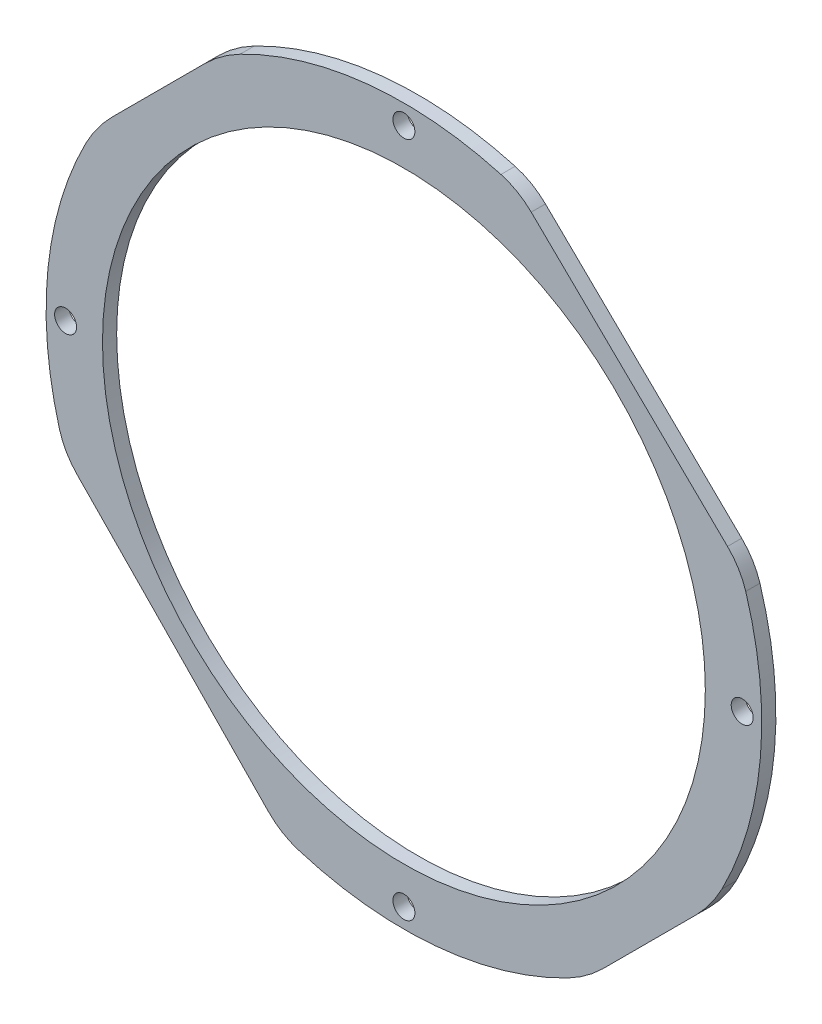
ISO-10303-21;
HEADER;
FILE_DESCRIPTION(('STEP AP214'),'2;1');
FILE_NAME('part.step','',(''),(''),'','','');
FILE_SCHEMA(('AUTOMOTIVE_DESIGN { 1 0 10303 214 1 1 1 1 }'));
ENDSEC;
DATA;
#1=APPLICATION_CONTEXT('core data for automotive mechanical design processes');
#2=APPLICATION_PROTOCOL_DEFINITION('international standard','automotive_design',2000,#1);
#3=PRODUCT_CONTEXT('',#1,'mechanical');
#4=PRODUCT('Part','Part','',(#3));
#5=PRODUCT_RELATED_PRODUCT_CATEGORY('part','',(#4));
#6=PRODUCT_DEFINITION_FORMATION('','',#4);
#7=PRODUCT_DEFINITION_CONTEXT('part definition',#1,'design');
#8=PRODUCT_DEFINITION('design','',#6,#7);
#9=PRODUCT_DEFINITION_SHAPE('','',#8);
#10=(LENGTH_UNIT() NAMED_UNIT(*) SI_UNIT(.MILLI.,.METRE.));
#11=(NAMED_UNIT(*) PLANE_ANGLE_UNIT() SI_UNIT($,.RADIAN.));
#12=(NAMED_UNIT(*) SI_UNIT($,.STERADIAN.) SOLID_ANGLE_UNIT());
#13=UNCERTAINTY_MEASURE_WITH_UNIT(LENGTH_MEASURE(1.E-05),#10,'distance_accuracy_value','');
#14=(GEOMETRIC_REPRESENTATION_CONTEXT(3) GLOBAL_UNCERTAINTY_ASSIGNED_CONTEXT((#13)) GLOBAL_UNIT_ASSIGNED_CONTEXT((#10,
#11,#12)) REPRESENTATION_CONTEXT('',''));
#15=CARTESIAN_POINT('',(0.,0.,0.));
#16=DIRECTION('',(0.,0.,1.));
#17=DIRECTION('',(1.,0.,0.));
#18=AXIS2_PLACEMENT_3D('',#15,#16,#17);
#19=CARTESIAN_POINT('',(0.,0.,2.));
#20=DIRECTION('',(0.,0.,1.));
#21=DIRECTION('',(1.,0.,0.));
#22=AXIS2_PLACEMENT_3D('',#19,#20,#21);
#23=PLANE('',#22);
#24=CARTESIAN_POINT('',(0.,0.,2.));
#25=DIRECTION('',(0.,0.,1.));
#26=DIRECTION('',(1.,0.,0.));
#27=AXIS2_PLACEMENT_3D('',#24,#25,#26);
#28=CIRCLE('',#27,50.45);
#29=CARTESIAN_POINT('',(44.8520396346069,-23.0975548622718,2.));
#30=VERTEX_POINT('',#29);
#31=CARTESIAN_POINT('',(48.1983056678512,14.903886431008,2.));
#32=VERTEX_POINT('',#31);
#33=EDGE_CURVE('E197',#30,#32,#28,.T.);
#34=ORIENTED_EDGE('',*,*,#33,.T.);
#35=CARTESIAN_POINT('',(38.6446276365626,11.9496968510262,2.));
#36=DIRECTION('',(0.,0.,1.));
#37=DIRECTION('',(1.,0.,0.));
#38=AXIS2_PLACEMENT_3D('',#35,#36,#37);
#39=CIRCLE('',#38,10.);
#40=CARTESIAN_POINT('',(45.6260217426126,19.1093153000785,2.));
#41=VERTEX_POINT('',#40);
#42=EDGE_CURVE('E264',#32,#41,#39,.T.);
#43=ORIENTED_EDGE('',*,*,#42,.T.);
#44=DIRECTION('',(0.715961844905232,-0.698139410605001,0.));
#45=VECTOR('',#44,1.);
#46=CARTESIAN_POINT('',(14.4791981741218,49.4808011593596,2.));
#47=LINE('',#46,#45);
#48=CARTESIAN_POINT('',(17.9533452758254,46.0931359825101,2.));
#49=VERTEX_POINT('',#48);
#50=EDGE_CURVE('E250',#49,#41,#47,.T.);
#51=ORIENTED_EDGE('',*,*,#50,.F.);
#52=CARTESIAN_POINT('',(10.9719511697754,38.9335175334578,2.));
#53=DIRECTION('',(0.,0.,1.));
#54=DIRECTION('',(1.,0.,0.));
#55=AXIS2_PLACEMENT_3D('',#52,#53,#54);
#56=CIRCLE('',#55,10.);
#57=CARTESIAN_POINT('',(13.6844236468522,48.5586145751037,2.));
#58=VERTEX_POINT('',#57);
#59=EDGE_CURVE('E262',#49,#58,#56,.T.);
#60=ORIENTED_EDGE('',*,*,#59,.T.);
#61=CARTESIAN_POINT('',(-23.0975548622721,44.8520396346067,2.));
#62=VERTEX_POINT('',#61);
#63=EDGE_CURVE('E194',#58,#62,#28,.T.);
#64=ORIENTED_EDGE('',*,*,#63,.T.);
#65=CARTESIAN_POINT('',(-13.9409424292604,27.0712508795595,2.));
#66=DIRECTION('',(0.,0.,1.));
#67=DIRECTION('',(1.,0.,0.));
#68=AXIS2_PLACEMENT_3D('',#65,#66,#67);
#69=CIRCLE('',#68,20.);
#70=CARTESIAN_POINT('',(-28.0830780529913,41.2133865032904,2.));
#71=VERTEX_POINT('',#70);
#72=EDGE_CURVE('E191',#62,#71,#69,.T.);
#73=ORIENTED_EDGE('',*,*,#72,.T.);
#74=DIRECTION('',(0.707106781186546,0.707106781186549,0.));
#75=VECTOR('',#74,1.);
#76=CARTESIAN_POINT('',(-26.1569867864594,43.1394777698223,2.));
#77=LINE('',#76,#75);
#78=CARTESIAN_POINT('',(-41.2133865032905,28.0830780529911,2.));
#79=VERTEX_POINT('',#78);
#80=EDGE_CURVE('E239',#79,#71,#77,.T.);
#81=ORIENTED_EDGE('',*,*,#80,.F.);
#82=CARTESIAN_POINT('',(-27.0712508795595,13.9409424292602,2.));
#83=DIRECTION('',(0.,0.,1.));
#84=DIRECTION('',(1.,0.,0.));
#85=AXIS2_PLACEMENT_3D('',#82,#83,#84);
#86=CIRCLE('',#85,20.);
#87=CARTESIAN_POINT('',(-44.8520396346068,23.0975548622718,2.));
#88=VERTEX_POINT('',#87);
#89=EDGE_CURVE('E193',#79,#88,#86,.T.);
#90=ORIENTED_EDGE('',*,*,#89,.T.);
#91=CARTESIAN_POINT('',(-48.5586145751037,-13.6844236468521,2.));
#92=VERTEX_POINT('',#91);
#93=EDGE_CURVE('E202',#88,#92,#28,.T.);
#94=ORIENTED_EDGE('',*,*,#93,.T.);
#95=CARTESIAN_POINT('',(-38.9335175334578,-10.9719511697754,2.));
#96=DIRECTION('',(0.,0.,1.));
#97=DIRECTION('',(1.,0.,0.));
#98=AXIS2_PLACEMENT_3D('',#95,#96,#97);
#99=CIRCLE('',#98,10.);
#100=CARTESIAN_POINT('',(-46.0931359825101,-17.9533452758254,2.));
#101=VERTEX_POINT('',#100);
#102=EDGE_CURVE('E258',#92,#101,#99,.T.);
#103=ORIENTED_EDGE('',*,*,#102,.T.);
#104=DIRECTION('',(-0.698139410605004,0.715961844905228,0.));
#105=VECTOR('',#104,1.);
#106=CARTESIAN_POINT('',(-49.4808011593596,-14.4791981741218,2.));
#107=LINE('',#106,#105);
#108=CARTESIAN_POINT('',(-19.109315300078,-45.6260217426127,2.));
#109=VERTEX_POINT('',#108);
#110=EDGE_CURVE('E165',#109,#101,#107,.T.);
#111=ORIENTED_EDGE('',*,*,#110,.F.);
#112=CARTESIAN_POINT('',(-11.9496968510257,-38.6446276365627,2.));
#113=DIRECTION('',(0.,0.,1.));
#114=DIRECTION('',(1.,0.,0.));
#115=AXIS2_PLACEMENT_3D('',#112,#113,#114);
#116=CIRCLE('',#115,10.);
#117=CARTESIAN_POINT('',(-14.9038864310074,-48.1983056678514,2.));
#118=VERTEX_POINT('',#117);
#119=EDGE_CURVE('E260',#109,#118,#116,.T.);
#120=ORIENTED_EDGE('',*,*,#119,.T.);
#121=CARTESIAN_POINT('',(23.097554862272,-44.8520396346067,2.));
#122=VERTEX_POINT('',#121);
#123=EDGE_CURVE('E200',#118,#122,#28,.T.);
#124=ORIENTED_EDGE('',*,*,#123,.T.);
#125=CARTESIAN_POINT('',(13.9409424292603,-27.0712508795595,2.));
#126=DIRECTION('',(0.,0.,1.));
#127=DIRECTION('',(1.,0.,0.));
#128=AXIS2_PLACEMENT_3D('',#125,#126,#127);
#129=CIRCLE('',#128,20.);
#130=CARTESIAN_POINT('',(28.0830780529913,-41.2133865032904,2.));
#131=VERTEX_POINT('',#130);
#132=EDGE_CURVE('E198',#122,#131,#129,.T.);
#133=ORIENTED_EDGE('',*,*,#132,.T.);
#134=DIRECTION('',(-0.707106781186546,-0.707106781186549,0.));
#135=VECTOR('',#134,1.);
#136=CARTESIAN_POINT('',(26.1569867864594,-43.1394777698223,2.));
#137=LINE('',#136,#135);
#138=CARTESIAN_POINT('',(41.2133865032905,-28.0830780529911,2.));
#139=VERTEX_POINT('',#138);
#140=EDGE_CURVE('E161',#139,#131,#137,.T.);
#141=ORIENTED_EDGE('',*,*,#140,.F.);
#142=CARTESIAN_POINT('',(27.0712508795595,-13.9409424292602,2.));
#143=DIRECTION('',(0.,0.,1.));
#144=DIRECTION('',(1.,0.,0.));
#145=AXIS2_PLACEMENT_3D('',#142,#143,#144);
#146=CIRCLE('',#145,20.);
#147=EDGE_CURVE('E195',#139,#30,#146,.T.);
#148=ORIENTED_EDGE('',*,*,#147,.T.);
#149=EDGE_LOOP('',(#34,#43,#51,#60,#64,#73,#81,#90,#94,#103,#111,#120,#124,#133,#141,#148));
#150=FACE_BOUND('',#149,.T.);
#151=CARTESIAN_POINT('',(0.,-47.7,2.));
#152=DIRECTION('',(0.,0.,1.));
#153=DIRECTION('',(1.,0.,0.));
#154=AXIS2_PLACEMENT_3D('',#151,#152,#153);
#155=CIRCLE('',#154,1.55000000000257);
#156=CARTESIAN_POINT('',(1.55000000000259,-47.7,2.));
#157=VERTEX_POINT('',#156);
#158=EDGE_CURVE('E229',#157,#157,#155,.T.);
#159=ORIENTED_EDGE('',*,*,#158,.F.);
#160=EDGE_LOOP('',(#159));
#161=FACE_BOUND('',#160,.T.);
#162=CARTESIAN_POINT('',(0.,0.,2.));
#163=DIRECTION('',(0.,0.,1.));
#164=DIRECTION('',(1.,0.,0.));
#165=AXIS2_PLACEMENT_3D('',#162,#163,#164);
#166=CIRCLE('',#165,42.5);
#167=CARTESIAN_POINT('',(42.5,0.,2.));
#168=VERTEX_POINT('',#167);
#169=EDGE_CURVE('E217',#168,#168,#166,.T.);
#170=ORIENTED_EDGE('',*,*,#169,.F.);
#171=EDGE_LOOP('',(#170));
#172=FACE_BOUND('',#171,.T.);
#173=CARTESIAN_POINT('',(0.,47.7,2.));
#174=DIRECTION('',(0.,0.,1.));
#175=DIRECTION('',(1.,0.,0.));
#176=AXIS2_PLACEMENT_3D('',#173,#174,#175);
#177=CIRCLE('',#176,1.55);
#178=CARTESIAN_POINT('',(1.55,47.7,2.));
#179=VERTEX_POINT('',#178);
#180=EDGE_CURVE('E205',#179,#179,#177,.T.);
#181=ORIENTED_EDGE('',*,*,#180,.F.);
#182=EDGE_LOOP('',(#181));
#183=FACE_BOUND('',#182,.T.);
#184=CARTESIAN_POINT('',(47.7,0.,2.));
#185=DIRECTION('',(0.,0.,1.));
#186=DIRECTION('',(1.,0.,0.));
#187=AXIS2_PLACEMENT_3D('',#184,#185,#186);
#188=CIRCLE('',#187,1.55000000000168);
#189=CARTESIAN_POINT('',(49.2500000000017,0.,2.));
#190=VERTEX_POINT('',#189);
#191=EDGE_CURVE('E223',#190,#190,#188,.T.);
#192=ORIENTED_EDGE('',*,*,#191,.F.);
#193=EDGE_LOOP('',(#192));
#194=FACE_BOUND('',#193,.T.);
#195=CARTESIAN_POINT('',(-47.7,0.,2.));
#196=DIRECTION('',(0.,0.,1.));
#197=DIRECTION('',(1.,0.,0.));
#198=AXIS2_PLACEMENT_3D('',#195,#196,#197);
#199=CIRCLE('',#198,1.55000000000089);
#200=CARTESIAN_POINT('',(-46.1499999999991,0.,2.));
#201=VERTEX_POINT('',#200);
#202=EDGE_CURVE('E235',#201,#201,#199,.T.);
#203=ORIENTED_EDGE('',*,*,#202,.F.);
#204=EDGE_LOOP('',(#203));
#205=FACE_BOUND('',#204,.T.);
#206=ADVANCED_FACE('F38',(#150,#161,#172,#183,#194,#205),#23,.T.);
#207=CARTESIAN_POINT('',(0.,0.,0.));
#208=DIRECTION('',(0.,0.,1.));
#209=DIRECTION('',(1.,0.,0.));
#210=AXIS2_PLACEMENT_3D('',#207,#208,#209);
#211=PLANE('',#210);
#212=CARTESIAN_POINT('',(-47.7,0.,0.));
#213=DIRECTION('',(0.,0.,1.));
#214=DIRECTION('',(1.,0.,0.));
#215=AXIS2_PLACEMENT_3D('',#212,#213,#214);
#216=CIRCLE('',#215,1.55000000000089);
#217=CARTESIAN_POINT('',(-46.1499999999991,0.,0.));
#218=VERTEX_POINT('',#217);
#219=EDGE_CURVE('E232',#218,#218,#216,.T.);
#220=ORIENTED_EDGE('',*,*,#219,.T.);
#221=EDGE_LOOP('',(#220));
#222=FACE_BOUND('',#221,.T.);
#223=CARTESIAN_POINT('',(0.,-47.7,0.));
#224=DIRECTION('',(0.,0.,1.));
#225=DIRECTION('',(1.,0.,0.));
#226=AXIS2_PLACEMENT_3D('',#223,#224,#225);
#227=CIRCLE('',#226,1.55000000000257);
#228=CARTESIAN_POINT('',(1.55000000000259,-47.7,0.));
#229=VERTEX_POINT('',#228);
#230=EDGE_CURVE('E226',#229,#229,#227,.T.);
#231=ORIENTED_EDGE('',*,*,#230,.T.);
#232=EDGE_LOOP('',(#231));
#233=FACE_BOUND('',#232,.T.);
#234=CARTESIAN_POINT('',(47.7,0.,0.));
#235=DIRECTION('',(0.,0.,1.));
#236=DIRECTION('',(1.,0.,0.));
#237=AXIS2_PLACEMENT_3D('',#234,#235,#236);
#238=CIRCLE('',#237,1.55000000000168);
#239=CARTESIAN_POINT('',(49.2500000000017,0.,0.));
#240=VERTEX_POINT('',#239);
#241=EDGE_CURVE('E220',#240,#240,#238,.T.);
#242=ORIENTED_EDGE('',*,*,#241,.T.);
#243=EDGE_LOOP('',(#242));
#244=FACE_BOUND('',#243,.T.);
#245=CARTESIAN_POINT('',(0.,0.,0.));
#246=DIRECTION('',(0.,0.,1.));
#247=DIRECTION('',(1.,0.,0.));
#248=AXIS2_PLACEMENT_3D('',#245,#246,#247);
#249=CIRCLE('',#248,42.5);
#250=CARTESIAN_POINT('',(42.5,0.,0.));
#251=VERTEX_POINT('',#250);
#252=EDGE_CURVE('E214',#251,#251,#249,.T.);
#253=ORIENTED_EDGE('',*,*,#252,.T.);
#254=EDGE_LOOP('',(#253));
#255=FACE_BOUND('',#254,.T.);
#256=CARTESIAN_POINT('',(0.,47.7,0.));
#257=DIRECTION('',(0.,0.,1.));
#258=DIRECTION('',(1.,0.,0.));
#259=AXIS2_PLACEMENT_3D('',#256,#257,#258);
#260=CIRCLE('',#259,1.55);
#261=CARTESIAN_POINT('',(1.55,47.7,0.));
#262=VERTEX_POINT('',#261);
#263=EDGE_CURVE('E211',#262,#262,#260,.T.);
#264=ORIENTED_EDGE('',*,*,#263,.T.);
#265=EDGE_LOOP('',(#264));
#266=FACE_BOUND('',#265,.T.);
#267=DIRECTION('',(0.715961844905232,-0.698139410605,0.));
#268=VECTOR('',#267,1.);
#269=CARTESIAN_POINT('',(31.789683509219,32.6012256412943,0.));
#270=LINE('',#269,#268);
#271=CARTESIAN_POINT('',(17.9533452758254,46.0931359825101,0.));
#272=VERTEX_POINT('',#271);
#273=CARTESIAN_POINT('',(45.6260217426126,19.1093153000785,0.));
#274=VERTEX_POINT('',#273);
#275=EDGE_CURVE('E311',#272,#274,#270,.T.);
#276=ORIENTED_EDGE('',*,*,#275,.T.);
#277=CARTESIAN_POINT('',(38.6446276365626,11.9496968510262,0.));
#278=DIRECTION('',(0.,0.,1.));
#279=DIRECTION('',(1.,0.,0.));
#280=AXIS2_PLACEMENT_3D('',#277,#278,#279);
#281=CIRCLE('',#280,10.);
#282=CARTESIAN_POINT('',(48.1983056678512,14.903886431008,0.));
#283=VERTEX_POINT('',#282);
#284=EDGE_CURVE('E274',#274,#283,#281,.F.);
#285=ORIENTED_EDGE('',*,*,#284,.T.);
#286=CARTESIAN_POINT('',(0.,0.,0.));
#287=DIRECTION('',(0.,0.,1.));
#288=DIRECTION('',(1.,0.,0.));
#289=AXIS2_PLACEMENT_3D('',#286,#287,#288);
#290=CIRCLE('',#289,50.45);
#291=CARTESIAN_POINT('',(44.8520396346069,-23.0975548622718,0.));
#292=VERTEX_POINT('',#291);
#293=EDGE_CURVE('E206',#292,#283,#290,.T.);
#294=ORIENTED_EDGE('',*,*,#293,.F.);
#295=CARTESIAN_POINT('',(27.0712508795595,-13.9409424292602,0.));
#296=DIRECTION('',(0.,0.,1.));
#297=DIRECTION('',(1.,0.,0.));
#298=AXIS2_PLACEMENT_3D('',#295,#296,#297);
#299=CIRCLE('',#298,20.);
#300=CARTESIAN_POINT('',(41.2133865032905,-28.0830780529911,0.));
#301=VERTEX_POINT('',#300);
#302=EDGE_CURVE('E174',#292,#301,#299,.F.);
#303=ORIENTED_EDGE('',*,*,#302,.T.);
#304=DIRECTION('',(-0.707106781186546,-0.707106781186549,0.));
#305=VECTOR('',#304,1.);
#306=CARTESIAN_POINT('',(34.6482322781409,-34.6482322781407,0.));
#307=LINE('',#306,#305);
#308=CARTESIAN_POINT('',(28.0830780529913,-41.2133865032904,0.));
#309=VERTEX_POINT('',#308);
#310=EDGE_CURVE('E158',#301,#309,#307,.T.);
#311=ORIENTED_EDGE('',*,*,#310,.T.);
#312=CARTESIAN_POINT('',(13.9409424292603,-27.0712508795595,0.));
#313=DIRECTION('',(0.,0.,1.));
#314=DIRECTION('',(1.,0.,0.));
#315=AXIS2_PLACEMENT_3D('',#312,#313,#314);
#316=CIRCLE('',#315,20.);
#317=CARTESIAN_POINT('',(23.097554862272,-44.8520396346067,0.));
#318=VERTEX_POINT('',#317);
#319=EDGE_CURVE('E171',#309,#318,#316,.F.);
#320=ORIENTED_EDGE('',*,*,#319,.T.);
#321=CARTESIAN_POINT('',(-14.9038864310074,-48.1983056678514,0.));
#322=VERTEX_POINT('',#321);
#323=EDGE_CURVE('E179',#322,#318,#290,.T.);
#324=ORIENTED_EDGE('',*,*,#323,.F.);
#325=CARTESIAN_POINT('',(-11.9496968510257,-38.6446276365627,0.));
#326=DIRECTION('',(0.,0.,1.));
#327=DIRECTION('',(1.,0.,0.));
#328=AXIS2_PLACEMENT_3D('',#325,#326,#327);
#329=CIRCLE('',#328,10.);
#330=CARTESIAN_POINT('',(-19.109315300078,-45.6260217426127,0.));
#331=VERTEX_POINT('',#330);
#332=EDGE_CURVE('E271',#322,#331,#329,.F.);
#333=ORIENTED_EDGE('',*,*,#332,.T.);
#334=DIRECTION('',(-0.698139410605004,0.715961844905228,0.));
#335=VECTOR('',#334,1.);
#336=CARTESIAN_POINT('',(-32.601225641294,-31.7896835092191,0.));
#337=LINE('',#336,#335);
#338=CARTESIAN_POINT('',(-46.0931359825101,-17.9533452758254,0.));
#339=VERTEX_POINT('',#338);
#340=EDGE_CURVE('E190',#331,#339,#337,.T.);
#341=ORIENTED_EDGE('',*,*,#340,.T.);
#342=CARTESIAN_POINT('',(-38.9335175334578,-10.9719511697754,0.));
#343=DIRECTION('',(0.,0.,1.));
#344=DIRECTION('',(1.,0.,0.));
#345=AXIS2_PLACEMENT_3D('',#342,#343,#344);
#346=CIRCLE('',#345,10.);
#347=CARTESIAN_POINT('',(-48.5586145751037,-13.6844236468521,0.));
#348=VERTEX_POINT('',#347);
#349=EDGE_CURVE('E61',#339,#348,#346,.F.);
#350=ORIENTED_EDGE('',*,*,#349,.T.);
#351=CARTESIAN_POINT('',(-44.8520396346068,23.0975548622718,0.));
#352=VERTEX_POINT('',#351);
#353=EDGE_CURVE('E182',#352,#348,#290,.T.);
#354=ORIENTED_EDGE('',*,*,#353,.F.);
#355=CARTESIAN_POINT('',(-27.0712508795595,13.9409424292602,0.));
#356=DIRECTION('',(0.,0.,1.));
#357=DIRECTION('',(1.,0.,0.));
#358=AXIS2_PLACEMENT_3D('',#355,#356,#357);
#359=CIRCLE('',#358,20.);
#360=CARTESIAN_POINT('',(-41.2133865032905,28.0830780529911,0.));
#361=VERTEX_POINT('',#360);
#362=EDGE_CURVE('E187',#352,#361,#359,.F.);
#363=ORIENTED_EDGE('',*,*,#362,.T.);
#364=DIRECTION('',(0.707106781186546,0.707106781186549,0.));
#365=VECTOR('',#364,1.);
#366=CARTESIAN_POINT('',(-34.6482322781409,34.6482322781407,0.));
#367=LINE('',#366,#365);
#368=CARTESIAN_POINT('',(-28.0830780529913,41.2133865032904,0.));
#369=VERTEX_POINT('',#368);
#370=EDGE_CURVE('E189',#361,#369,#367,.T.);
#371=ORIENTED_EDGE('',*,*,#370,.T.);
#372=CARTESIAN_POINT('',(-13.9409424292604,27.0712508795595,0.));
#373=DIRECTION('',(0.,0.,1.));
#374=DIRECTION('',(1.,0.,0.));
#375=AXIS2_PLACEMENT_3D('',#372,#373,#374);
#376=CIRCLE('',#375,20.);
#377=CARTESIAN_POINT('',(-23.0975548622721,44.8520396346067,0.));
#378=VERTEX_POINT('',#377);
#379=EDGE_CURVE('E243',#369,#378,#376,.F.);
#380=ORIENTED_EDGE('',*,*,#379,.T.);
#381=CARTESIAN_POINT('',(13.6844236468522,48.5586145751037,0.));
#382=VERTEX_POINT('',#381);
#383=EDGE_CURVE('E183',#382,#378,#290,.T.);
#384=ORIENTED_EDGE('',*,*,#383,.F.);
#385=CARTESIAN_POINT('',(10.9719511697754,38.9335175334578,0.));
#386=DIRECTION('',(0.,0.,1.));
#387=DIRECTION('',(1.,0.,0.));
#388=AXIS2_PLACEMENT_3D('',#385,#386,#387);
#389=CIRCLE('',#388,10.);
#390=EDGE_CURVE('E53',#382,#272,#389,.F.);
#391=ORIENTED_EDGE('',*,*,#390,.T.);
#392=EDGE_LOOP('',(#276,#285,#294,#303,#311,#320,#324,#333,#341,#350,#354,#363,#371,#380,#384,#391));
#393=FACE_BOUND('',#392,.T.);
#394=ADVANCED_FACE('F169',(#222,#233,#244,#255,#266,#393),#211,.F.);
#395=CARTESIAN_POINT('',(0.,0.,2.));
#396=DIRECTION('',(0.,0.,-1.));
#397=DIRECTION('',(-1.,0.,0.));
#398=AXIS2_PLACEMENT_3D('',#395,#396,#397);
#399=CYLINDRICAL_SURFACE('',#398,50.45);
#400=ORIENTED_EDGE('',*,*,#123,.F.);
#401=DIRECTION('',(0.,0.,-1.));
#402=VECTOR('',#401,1.);
#403=CARTESIAN_POINT('',(-14.9038864310074,-48.1983056678514,2.));
#404=LINE('',#403,#402);
#405=EDGE_CURVE('E278',#118,#322,#404,.T.);
#406=ORIENTED_EDGE('',*,*,#405,.T.);
#407=ORIENTED_EDGE('',*,*,#323,.T.);
#408=DIRECTION('',(0.,0.,-1.));
#409=VECTOR('',#408,1.);
#410=CARTESIAN_POINT('',(23.097554862272,-44.8520396346067,2.));
#411=LINE('',#410,#409);
#412=EDGE_CURVE('E178',#318,#122,#411,.F.);
#413=ORIENTED_EDGE('',*,*,#412,.T.);
#414=EDGE_LOOP('',(#400,#406,#407,#413));
#415=FACE_BOUND('',#414,.T.);
#416=ADVANCED_FACE('F298',(#415),#399,.T.);
#417=ORIENTED_EDGE('',*,*,#293,.T.);
#418=DIRECTION('',(0.,0.,-1.));
#419=VECTOR('',#418,1.);
#420=CARTESIAN_POINT('',(48.1983056678512,14.903886431008,2.));
#421=LINE('',#420,#419);
#422=EDGE_CURVE('E253',#283,#32,#421,.F.);
#423=ORIENTED_EDGE('',*,*,#422,.T.);
#424=ORIENTED_EDGE('',*,*,#33,.F.);
#425=DIRECTION('',(0.,0.,-1.));
#426=VECTOR('',#425,1.);
#427=CARTESIAN_POINT('',(44.8520396346069,-23.0975548622718,2.));
#428=LINE('',#427,#426);
#429=EDGE_CURVE('E209',#30,#292,#428,.T.);
#430=ORIENTED_EDGE('',*,*,#429,.T.);
#431=EDGE_LOOP('',(#417,#423,#424,#430));
#432=FACE_BOUND('',#431,.T.);
#433=ADVANCED_FACE('F332',(#432),#399,.T.);
#434=ORIENTED_EDGE('',*,*,#63,.F.);
#435=DIRECTION('',(0.,0.,-1.));
#436=VECTOR('',#435,1.);
#437=CARTESIAN_POINT('',(13.6844236468522,48.5586145751037,2.));
#438=LINE('',#437,#436);
#439=EDGE_CURVE('E276',#58,#382,#438,.T.);
#440=ORIENTED_EDGE('',*,*,#439,.T.);
#441=ORIENTED_EDGE('',*,*,#383,.T.);
#442=DIRECTION('',(0.,0.,-1.));
#443=VECTOR('',#442,1.);
#444=CARTESIAN_POINT('',(-23.0975548622721,44.8520396346067,2.));
#445=LINE('',#444,#443);
#446=EDGE_CURVE('E318',#378,#62,#445,.F.);
#447=ORIENTED_EDGE('',*,*,#446,.T.);
#448=EDGE_LOOP('',(#434,#440,#441,#447));
#449=FACE_BOUND('',#448,.T.);
#450=ADVANCED_FACE('F411',(#449),#399,.T.);
#451=ORIENTED_EDGE('',*,*,#353,.T.);
#452=DIRECTION('',(0.,0.,-1.));
#453=VECTOR('',#452,1.);
#454=CARTESIAN_POINT('',(-48.5586145751037,-13.6844236468521,2.));
#455=LINE('',#454,#453);
#456=EDGE_CURVE('E11',#348,#92,#455,.F.);
#457=ORIENTED_EDGE('',*,*,#456,.T.);
#458=ORIENTED_EDGE('',*,*,#93,.F.);
#459=DIRECTION('',(0.,0.,-1.));
#460=VECTOR('',#459,1.);
#461=CARTESIAN_POINT('',(-44.8520396346068,23.0975548622718,2.));
#462=LINE('',#461,#460);
#463=EDGE_CURVE('E203',#88,#352,#462,.T.);
#464=ORIENTED_EDGE('',*,*,#463,.T.);
#465=EDGE_LOOP('',(#451,#457,#458,#464));
#466=FACE_BOUND('',#465,.T.);
#467=ADVANCED_FACE('F303',(#466),#399,.T.);
#468=CARTESIAN_POINT('',(0.,47.7,2.));
#469=DIRECTION('',(0.,0.,-1.));
#470=DIRECTION('',(-1.,0.,0.));
#471=AXIS2_PLACEMENT_3D('',#468,#469,#470);
#472=CYLINDRICAL_SURFACE('',#471,1.55);
#473=ORIENTED_EDGE('',*,*,#180,.T.);
#474=EDGE_LOOP('',(#473));
#475=FACE_BOUND('',#474,.T.);
#476=ORIENTED_EDGE('',*,*,#263,.F.);
#477=EDGE_LOOP('',(#476));
#478=FACE_BOUND('',#477,.T.);
#479=ADVANCED_FACE('F410',(#475,#478),#472,.F.);
#480=CARTESIAN_POINT('',(0.,0.,2.));
#481=DIRECTION('',(0.,0.,-1.));
#482=DIRECTION('',(-1.,0.,0.));
#483=AXIS2_PLACEMENT_3D('',#480,#481,#482);
#484=CYLINDRICAL_SURFACE('',#483,42.5);
#485=ORIENTED_EDGE('',*,*,#169,.T.);
#486=EDGE_LOOP('',(#485));
#487=FACE_BOUND('',#486,.T.);
#488=ORIENTED_EDGE('',*,*,#252,.F.);
#489=EDGE_LOOP('',(#488));
#490=FACE_BOUND('',#489,.T.);
#491=ADVANCED_FACE('F516',(#487,#490),#484,.F.);
#492=CARTESIAN_POINT('',(47.7,0.,2.));
#493=DIRECTION('',(0.,0.,-1.));
#494=DIRECTION('',(-1.,0.,0.));
#495=AXIS2_PLACEMENT_3D('',#492,#493,#494);
#496=CYLINDRICAL_SURFACE('',#495,1.55000000000168);
#497=ORIENTED_EDGE('',*,*,#191,.T.);
#498=EDGE_LOOP('',(#497));
#499=FACE_BOUND('',#498,.T.);
#500=ORIENTED_EDGE('',*,*,#241,.F.);
#501=EDGE_LOOP('',(#500));
#502=FACE_BOUND('',#501,.T.);
#503=ADVANCED_FACE('F506',(#499,#502),#496,.F.);
#504=CARTESIAN_POINT('',(0.,-47.7,2.));
#505=DIRECTION('',(0.,0.,-1.));
#506=DIRECTION('',(-1.,0.,0.));
#507=AXIS2_PLACEMENT_3D('',#504,#505,#506);
#508=CYLINDRICAL_SURFACE('',#507,1.55000000000257);
#509=ORIENTED_EDGE('',*,*,#158,.T.);
#510=EDGE_LOOP('',(#509));
#511=FACE_BOUND('',#510,.T.);
#512=ORIENTED_EDGE('',*,*,#230,.F.);
#513=EDGE_LOOP('',(#512));
#514=FACE_BOUND('',#513,.T.);
#515=ADVANCED_FACE('F496',(#511,#514),#508,.F.);
#516=CARTESIAN_POINT('',(-47.7,0.,2.));
#517=DIRECTION('',(0.,0.,-1.));
#518=DIRECTION('',(-1.,0.,0.));
#519=AXIS2_PLACEMENT_3D('',#516,#517,#518);
#520=CYLINDRICAL_SURFACE('',#519,1.55000000000089);
#521=ORIENTED_EDGE('',*,*,#202,.T.);
#522=EDGE_LOOP('',(#521));
#523=FACE_BOUND('',#522,.T.);
#524=ORIENTED_EDGE('',*,*,#219,.F.);
#525=EDGE_LOOP('',(#524));
#526=FACE_BOUND('',#525,.T.);
#527=ADVANCED_FACE('F486',(#523,#526),#520,.F.);
#528=CARTESIAN_POINT('',(-26.1569867864594,43.1394777698223,-6.));
#529=DIRECTION('',(0.707106781186549,-0.707106781186546,0.));
#530=DIRECTION('',(0.707106781186546,0.707106781186549,0.));
#531=AXIS2_PLACEMENT_3D('',#528,#529,#530);
#532=PLANE('',#531);
#533=ORIENTED_EDGE('',*,*,#80,.T.);
#534=DIRECTION('',(0.,0.,-1.));
#535=VECTOR('',#534,1.);
#536=CARTESIAN_POINT('',(-28.0830780529913,41.2133865032904,-6.));
#537=LINE('',#536,#535);
#538=EDGE_CURVE('E246',#71,#369,#537,.T.);
#539=ORIENTED_EDGE('',*,*,#538,.T.);
#540=ORIENTED_EDGE('',*,*,#370,.F.);
#541=DIRECTION('',(0.,0.,-1.));
#542=VECTOR('',#541,1.);
#543=CARTESIAN_POINT('',(-41.2133865032905,28.0830780529911,-6.));
#544=LINE('',#543,#542);
#545=EDGE_CURVE('E312',#361,#79,#544,.F.);
#546=ORIENTED_EDGE('',*,*,#545,.T.);
#547=EDGE_LOOP('',(#533,#539,#540,#546));
#548=FACE_BOUND('',#547,.T.);
#549=ADVANCED_FACE('F477',(#548),#532,.F.);
#550=CARTESIAN_POINT('',(26.1569867864594,-43.1394777698223,-6.));
#551=DIRECTION('',(-0.707106781186549,0.707106781186546,0.));
#552=DIRECTION('',(-0.707106781186546,-0.707106781186549,0.));
#553=AXIS2_PLACEMENT_3D('',#550,#551,#552);
#554=PLANE('',#553);
#555=ORIENTED_EDGE('',*,*,#310,.F.);
#556=DIRECTION('',(0.,0.,-1.));
#557=VECTOR('',#556,1.);
#558=CARTESIAN_POINT('',(41.2133865032905,-28.0830780529911,-6.));
#559=LINE('',#558,#557);
#560=EDGE_CURVE('E248',#301,#139,#559,.F.);
#561=ORIENTED_EDGE('',*,*,#560,.T.);
#562=ORIENTED_EDGE('',*,*,#140,.T.);
#563=DIRECTION('',(0.,0.,-1.));
#564=VECTOR('',#563,1.);
#565=CARTESIAN_POINT('',(28.0830780529913,-41.2133865032904,-6.));
#566=LINE('',#565,#564);
#567=EDGE_CURVE('E155',#131,#309,#566,.T.);
#568=ORIENTED_EDGE('',*,*,#567,.T.);
#569=EDGE_LOOP('',(#555,#561,#562,#568));
#570=FACE_BOUND('',#569,.T.);
#571=ADVANCED_FACE('F157',(#570),#554,.F.);
#572=CARTESIAN_POINT('',(-13.9409424292604,27.0712508795595,2.));
#573=DIRECTION('',(0.,0.,-1.));
#574=DIRECTION('',(-1.,0.,0.));
#575=AXIS2_PLACEMENT_3D('',#572,#573,#574);
#576=CYLINDRICAL_SURFACE('',#575,20.);
#577=ORIENTED_EDGE('',*,*,#379,.F.);
#578=ORIENTED_EDGE('',*,*,#538,.F.);
#579=ORIENTED_EDGE('',*,*,#72,.F.);
#580=ORIENTED_EDGE('',*,*,#446,.F.);
#581=EDGE_LOOP('',(#577,#578,#579,#580));
#582=FACE_BOUND('',#581,.T.);
#583=ADVANCED_FACE('F338',(#582),#576,.T.);
#584=CARTESIAN_POINT('',(27.0712508795595,-13.9409424292602,2.));
#585=DIRECTION('',(0.,0.,-1.));
#586=DIRECTION('',(-1.,0.,0.));
#587=AXIS2_PLACEMENT_3D('',#584,#585,#586);
#588=CYLINDRICAL_SURFACE('',#587,20.);
#589=ORIENTED_EDGE('',*,*,#147,.F.);
#590=ORIENTED_EDGE('',*,*,#560,.F.);
#591=ORIENTED_EDGE('',*,*,#302,.F.);
#592=ORIENTED_EDGE('',*,*,#429,.F.);
#593=EDGE_LOOP('',(#589,#590,#591,#592));
#594=FACE_BOUND('',#593,.T.);
#595=ADVANCED_FACE('F336',(#594),#588,.T.);
#596=CARTESIAN_POINT('',(13.9409424292603,-27.0712508795595,2.));
#597=DIRECTION('',(0.,0.,-1.));
#598=DIRECTION('',(-1.,0.,0.));
#599=AXIS2_PLACEMENT_3D('',#596,#597,#598);
#600=CYLINDRICAL_SURFACE('',#599,20.);
#601=ORIENTED_EDGE('',*,*,#319,.F.);
#602=ORIENTED_EDGE('',*,*,#567,.F.);
#603=ORIENTED_EDGE('',*,*,#132,.F.);
#604=ORIENTED_EDGE('',*,*,#412,.F.);
#605=EDGE_LOOP('',(#601,#602,#603,#604));
#606=FACE_BOUND('',#605,.T.);
#607=ADVANCED_FACE('F176',(#606),#600,.T.);
#608=CARTESIAN_POINT('',(-27.0712508795595,13.9409424292602,2.));
#609=DIRECTION('',(0.,0.,-1.));
#610=DIRECTION('',(-1.,0.,0.));
#611=AXIS2_PLACEMENT_3D('',#608,#609,#610);
#612=CYLINDRICAL_SURFACE('',#611,20.);
#613=ORIENTED_EDGE('',*,*,#89,.F.);
#614=ORIENTED_EDGE('',*,*,#545,.F.);
#615=ORIENTED_EDGE('',*,*,#362,.F.);
#616=ORIENTED_EDGE('',*,*,#463,.F.);
#617=EDGE_LOOP('',(#613,#614,#615,#616));
#618=FACE_BOUND('',#617,.T.);
#619=ADVANCED_FACE('F344',(#618),#612,.T.);
#620=CARTESIAN_POINT('',(-49.4808011593596,-14.4791981741218,-8.));
#621=DIRECTION('',(0.715961844905228,0.698139410605004,0.));
#622=DIRECTION('',(-0.698139410605004,0.715961844905228,0.));
#623=AXIS2_PLACEMENT_3D('',#620,#621,#622);
#624=PLANE('',#623);
#625=ORIENTED_EDGE('',*,*,#340,.F.);
#626=DIRECTION('',(0.,0.,-1.));
#627=VECTOR('',#626,1.);
#628=CARTESIAN_POINT('',(-19.109315300078,-45.6260217426127,-8.));
#629=LINE('',#628,#627);
#630=EDGE_CURVE('E46',#331,#109,#629,.F.);
#631=ORIENTED_EDGE('',*,*,#630,.T.);
#632=ORIENTED_EDGE('',*,*,#110,.T.);
#633=DIRECTION('',(0.,0.,-1.));
#634=VECTOR('',#633,1.);
#635=CARTESIAN_POINT('',(-46.0931359825101,-17.9533452758254,-8.));
#636=LINE('',#635,#634);
#637=EDGE_CURVE('E281',#101,#339,#636,.T.);
#638=ORIENTED_EDGE('',*,*,#637,.T.);
#639=EDGE_LOOP('',(#625,#631,#632,#638));
#640=FACE_BOUND('',#639,.T.);
#641=ADVANCED_FACE('F286',(#640),#624,.F.);
#642=CARTESIAN_POINT('',(14.4791981741218,49.4808011593596,-8.));
#643=DIRECTION('',(-0.698139410605,-0.715961844905232,0.));
#644=DIRECTION('',(0.715961844905232,-0.698139410605,0.));
#645=AXIS2_PLACEMENT_3D('',#642,#643,#644);
#646=PLANE('',#645);
#647=ORIENTED_EDGE('',*,*,#50,.T.);
#648=DIRECTION('',(0.,0.,-1.));
#649=VECTOR('',#648,1.);
#650=CARTESIAN_POINT('',(45.6260217426126,19.1093153000785,-8.));
#651=LINE('',#650,#649);
#652=EDGE_CURVE('E268',#41,#274,#651,.T.);
#653=ORIENTED_EDGE('',*,*,#652,.T.);
#654=ORIENTED_EDGE('',*,*,#275,.F.);
#655=DIRECTION('',(0.,0.,-1.));
#656=VECTOR('',#655,1.);
#657=CARTESIAN_POINT('',(17.9533452758254,46.0931359825101,-8.));
#658=LINE('',#657,#656);
#659=EDGE_CURVE('E266',#272,#49,#658,.F.);
#660=ORIENTED_EDGE('',*,*,#659,.T.);
#661=EDGE_LOOP('',(#647,#653,#654,#660));
#662=FACE_BOUND('',#661,.T.);
#663=ADVANCED_FACE('F360',(#662),#646,.F.);
#664=CARTESIAN_POINT('',(38.6446276365626,11.9496968510262,2.));
#665=DIRECTION('',(0.,0.,-1.));
#666=DIRECTION('',(-1.,0.,0.));
#667=AXIS2_PLACEMENT_3D('',#664,#665,#666);
#668=CYLINDRICAL_SURFACE('',#667,10.);
#669=ORIENTED_EDGE('',*,*,#284,.F.);
#670=ORIENTED_EDGE('',*,*,#652,.F.);
#671=ORIENTED_EDGE('',*,*,#42,.F.);
#672=ORIENTED_EDGE('',*,*,#422,.F.);
#673=EDGE_LOOP('',(#669,#670,#671,#672));
#674=FACE_BOUND('',#673,.T.);
#675=ADVANCED_FACE('F330',(#674),#668,.T.);
#676=CARTESIAN_POINT('',(10.9719511697754,38.9335175334578,2.));
#677=DIRECTION('',(0.,0.,-1.));
#678=DIRECTION('',(-1.,0.,0.));
#679=AXIS2_PLACEMENT_3D('',#676,#677,#678);
#680=CYLINDRICAL_SURFACE('',#679,10.);
#681=ORIENTED_EDGE('',*,*,#59,.F.);
#682=ORIENTED_EDGE('',*,*,#659,.F.);
#683=ORIENTED_EDGE('',*,*,#390,.F.);
#684=ORIENTED_EDGE('',*,*,#439,.F.);
#685=EDGE_LOOP('',(#681,#682,#683,#684));
#686=FACE_BOUND('',#685,.T.);
#687=ADVANCED_FACE('F359',(#686),#680,.T.);
#688=CARTESIAN_POINT('',(-11.9496968510257,-38.6446276365627,2.));
#689=DIRECTION('',(0.,0.,-1.));
#690=DIRECTION('',(-1.,0.,0.));
#691=AXIS2_PLACEMENT_3D('',#688,#689,#690);
#692=CYLINDRICAL_SURFACE('',#691,10.);
#693=ORIENTED_EDGE('',*,*,#119,.F.);
#694=ORIENTED_EDGE('',*,*,#630,.F.);
#695=ORIENTED_EDGE('',*,*,#332,.F.);
#696=ORIENTED_EDGE('',*,*,#405,.F.);
#697=EDGE_LOOP('',(#693,#694,#695,#696));
#698=FACE_BOUND('',#697,.T.);
#699=ADVANCED_FACE('F296',(#698),#692,.T.);
#700=CARTESIAN_POINT('',(-38.9335175334578,-10.9719511697754,2.));
#701=DIRECTION('',(0.,0.,-1.));
#702=DIRECTION('',(-1.,0.,0.));
#703=AXIS2_PLACEMENT_3D('',#700,#701,#702);
#704=CYLINDRICAL_SURFACE('',#703,10.);
#705=ORIENTED_EDGE('',*,*,#349,.F.);
#706=ORIENTED_EDGE('',*,*,#637,.F.);
#707=ORIENTED_EDGE('',*,*,#102,.F.);
#708=ORIENTED_EDGE('',*,*,#456,.F.);
#709=EDGE_LOOP('',(#705,#706,#707,#708));
#710=FACE_BOUND('',#709,.T.);
#711=ADVANCED_FACE('F40',(#710),#704,.T.);
#712=CLOSED_SHELL('',(#206,#394,#416,#433,#450,#467,#479,#491,#503,#515,#527,#549,#571,#583,
#595,#607,#619,#641,#663,#675,#687,#699,#711));
#713=MANIFOLD_SOLID_BREP('B2',#712);
#714=ADVANCED_BREP_SHAPE_REPRESENTATION('',(#18,#713),#14);
#715=SHAPE_DEFINITION_REPRESENTATION(#9,#714);
ENDSEC;
END-ISO-10303-21;
